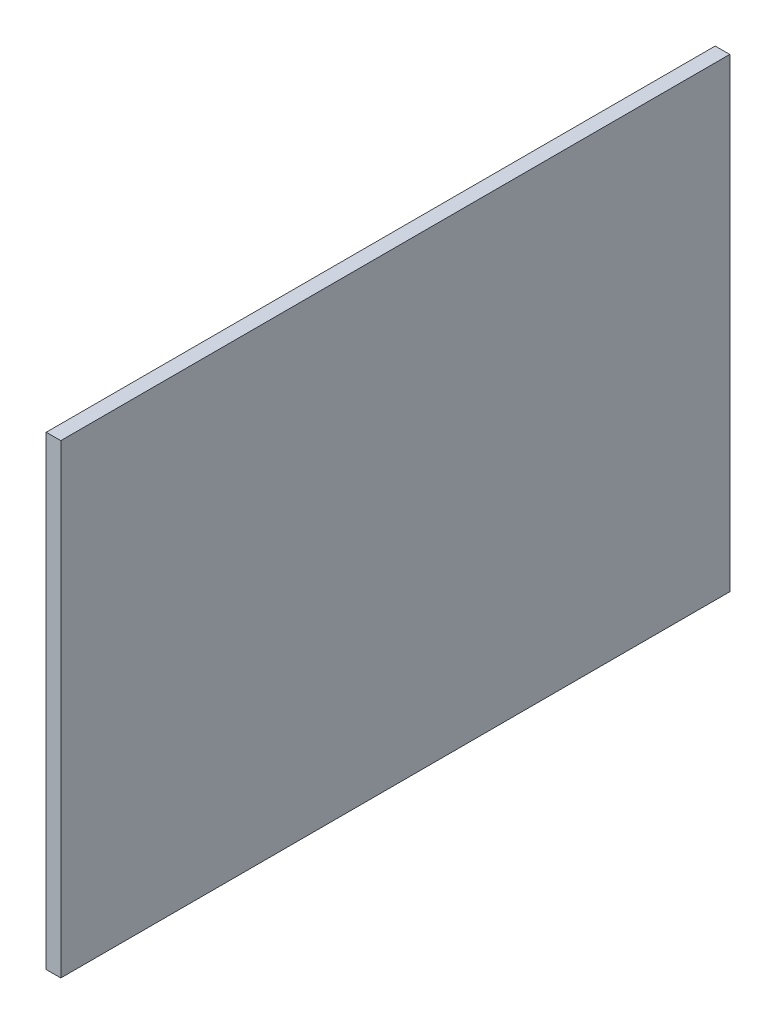
ISO-10303-21;
HEADER;
FILE_DESCRIPTION(('STEP AP214'),'2;1');
FILE_NAME('part.step','',(''),(''),'','','');
FILE_SCHEMA(('AUTOMOTIVE_DESIGN { 1 0 10303 214 1 1 1 1 }'));
ENDSEC;
DATA;
#1=APPLICATION_CONTEXT('core data for automotive mechanical design processes');
#2=APPLICATION_PROTOCOL_DEFINITION('international standard','automotive_design',2000,#1);
#3=PRODUCT_CONTEXT('',#1,'mechanical');
#4=PRODUCT('Part','Part','',(#3));
#5=PRODUCT_RELATED_PRODUCT_CATEGORY('part','',(#4));
#6=PRODUCT_DEFINITION_FORMATION('','',#4);
#7=PRODUCT_DEFINITION_CONTEXT('part definition',#1,'design');
#8=PRODUCT_DEFINITION('design','',#6,#7);
#9=PRODUCT_DEFINITION_SHAPE('','',#8);
#10=(LENGTH_UNIT() NAMED_UNIT(*) SI_UNIT(.MILLI.,.METRE.));
#11=(NAMED_UNIT(*) PLANE_ANGLE_UNIT() SI_UNIT($,.RADIAN.));
#12=(NAMED_UNIT(*) SI_UNIT($,.STERADIAN.) SOLID_ANGLE_UNIT());
#13=UNCERTAINTY_MEASURE_WITH_UNIT(LENGTH_MEASURE(1.E-05),#10,'distance_accuracy_value','');
#14=(GEOMETRIC_REPRESENTATION_CONTEXT(3) GLOBAL_UNCERTAINTY_ASSIGNED_CONTEXT((#13)) GLOBAL_UNIT_ASSIGNED_CONTEXT((#10,
#11,#12)) REPRESENTATION_CONTEXT('',''));
#15=CARTESIAN_POINT('',(0.,0.,0.));
#16=DIRECTION('',(0.,0.,1.));
#17=DIRECTION('',(1.,0.,0.));
#18=AXIS2_PLACEMENT_3D('',#15,#16,#17);
#19=CARTESIAN_POINT('',(3.175,57.9577808529253,74.9412550679312));
#20=DIRECTION('',(0.,0.,-1.));
#21=DIRECTION('',(-1.,0.,0.));
#22=AXIS2_PLACEMENT_3D('',#19,#20,#21);
#23=PLANE('',#22);
#24=DIRECTION('',(0.,-1.,0.));
#25=VECTOR('',#24,1.);
#26=CARTESIAN_POINT('',(0.,57.9577808529253,74.9412550679312));
#27=LINE('',#26,#25);
#28=CARTESIAN_POINT('',(0.,57.9577808529253,74.9412550679312));
#29=VERTEX_POINT('',#28);
#30=CARTESIAN_POINT('',(0.,-43.6422191470747,74.9412550679312));
#31=VERTEX_POINT('',#30);
#32=EDGE_CURVE('E96',#29,#31,#27,.T.);
#33=ORIENTED_EDGE('',*,*,#32,.T.);
#34=DIRECTION('',(-1.,0.,0.));
#35=VECTOR('',#34,1.);
#36=CARTESIAN_POINT('',(3.175,-43.6422191470747,74.9412550679312));
#37=LINE('',#36,#35);
#38=CARTESIAN_POINT('',(3.175,-43.6422191470747,74.9412550679312));
#39=VERTEX_POINT('',#38);
#40=EDGE_CURVE('E11',#39,#31,#37,.T.);
#41=ORIENTED_EDGE('',*,*,#40,.F.);
#42=DIRECTION('',(0.,-1.,0.));
#43=VECTOR('',#42,1.);
#44=CARTESIAN_POINT('',(3.175,57.9577808529253,74.9412550679312));
#45=LINE('',#44,#43);
#46=CARTESIAN_POINT('',(3.175,57.9577808529253,74.9412550679312));
#47=VERTEX_POINT('',#46);
#48=EDGE_CURVE('E84',#47,#39,#45,.T.);
#49=ORIENTED_EDGE('',*,*,#48,.F.);
#50=DIRECTION('',(-1.,0.,0.));
#51=VECTOR('',#50,1.);
#52=CARTESIAN_POINT('',(3.175,57.9577808529253,74.9412550679312));
#53=LINE('',#52,#51);
#54=EDGE_CURVE('E92',#47,#29,#53,.T.);
#55=ORIENTED_EDGE('',*,*,#54,.T.);
#56=EDGE_LOOP('',(#33,#41,#49,#55));
#57=FACE_BOUND('',#56,.T.);
#58=ADVANCED_FACE('F33',(#57),#23,.F.);
#59=CARTESIAN_POINT('',(3.175,-43.6422191470747,74.9412550679312));
#60=DIRECTION('',(0.,1.,0.));
#61=DIRECTION('',(0.,0.,1.));
#62=AXIS2_PLACEMENT_3D('',#59,#60,#61);
#63=PLANE('',#62);
#64=DIRECTION('',(0.,0.,-1.));
#65=VECTOR('',#64,1.);
#66=CARTESIAN_POINT('',(0.,-43.6422191470747,74.9412550679312));
#67=LINE('',#66,#65);
#68=CARTESIAN_POINT('',(0.,-43.6422191470747,-71.1087449320688));
#69=VERTEX_POINT('',#68);
#70=EDGE_CURVE('E88',#31,#69,#67,.T.);
#71=ORIENTED_EDGE('',*,*,#70,.T.);
#72=DIRECTION('',(-1.,0.,0.));
#73=VECTOR('',#72,1.);
#74=CARTESIAN_POINT('',(3.175,-43.6422191470747,-71.1087449320688));
#75=LINE('',#74,#73);
#76=CARTESIAN_POINT('',(3.175,-43.6422191470747,-71.1087449320688));
#77=VERTEX_POINT('',#76);
#78=EDGE_CURVE('E41',#77,#69,#75,.T.);
#79=ORIENTED_EDGE('',*,*,#78,.F.);
#80=DIRECTION('',(0.,0.,-1.));
#81=VECTOR('',#80,1.);
#82=CARTESIAN_POINT('',(3.175,-43.6422191470747,74.9412550679312));
#83=LINE('',#82,#81);
#84=EDGE_CURVE('E79',#39,#77,#83,.T.);
#85=ORIENTED_EDGE('',*,*,#84,.F.);
#86=ORIENTED_EDGE('',*,*,#40,.T.);
#87=EDGE_LOOP('',(#71,#79,#85,#86));
#88=FACE_BOUND('',#87,.T.);
#89=ADVANCED_FACE('F87',(#88),#63,.F.);
#90=CARTESIAN_POINT('',(3.175,57.9577808529253,-71.1087449320688));
#91=DIRECTION('',(0.,0.,1.));
#92=DIRECTION('',(0.,-1.,0.));
#93=AXIS2_PLACEMENT_3D('',#90,#91,#92);
#94=PLANE('',#93);
#95=DIRECTION('',(0.,1.,0.));
#96=VECTOR('',#95,1.);
#97=CARTESIAN_POINT('',(0.,57.9577808529253,-71.1087449320688));
#98=LINE('',#97,#96);
#99=CARTESIAN_POINT('',(0.,57.9577808529253,-71.1087449320688));
#100=VERTEX_POINT('',#99);
#101=EDGE_CURVE('E66',#69,#100,#98,.T.);
#102=ORIENTED_EDGE('',*,*,#101,.T.);
#103=DIRECTION('',(-1.,0.,0.));
#104=VECTOR('',#103,1.);
#105=CARTESIAN_POINT('',(3.175,57.9577808529253,-71.1087449320688));
#106=LINE('',#105,#104);
#107=CARTESIAN_POINT('',(3.175,57.9577808529253,-71.1087449320688));
#108=VERTEX_POINT('',#107);
#109=EDGE_CURVE('E89',#108,#100,#106,.T.);
#110=ORIENTED_EDGE('',*,*,#109,.F.);
#111=DIRECTION('',(0.,1.,0.));
#112=VECTOR('',#111,1.);
#113=CARTESIAN_POINT('',(3.175,57.9577808529253,-71.1087449320688));
#114=LINE('',#113,#112);
#115=EDGE_CURVE('E82',#77,#108,#114,.T.);
#116=ORIENTED_EDGE('',*,*,#115,.F.);
#117=ORIENTED_EDGE('',*,*,#78,.T.);
#118=EDGE_LOOP('',(#102,#110,#116,#117));
#119=FACE_BOUND('',#118,.T.);
#120=ADVANCED_FACE('F90',(#119),#94,.F.);
#121=CARTESIAN_POINT('',(3.175,57.9577808529253,74.9412550679312));
#122=DIRECTION('',(0.,-1.,0.));
#123=DIRECTION('',(0.,0.,-1.));
#124=AXIS2_PLACEMENT_3D('',#121,#122,#123);
#125=PLANE('',#124);
#126=DIRECTION('',(0.,0.,1.));
#127=VECTOR('',#126,1.);
#128=CARTESIAN_POINT('',(0.,57.9577808529253,74.9412550679312));
#129=LINE('',#128,#127);
#130=EDGE_CURVE('E72',#100,#29,#129,.T.);
#131=ORIENTED_EDGE('',*,*,#130,.T.);
#132=ORIENTED_EDGE('',*,*,#54,.F.);
#133=DIRECTION('',(0.,0.,1.));
#134=VECTOR('',#133,1.);
#135=CARTESIAN_POINT('',(3.175,57.9577808529253,74.9412550679312));
#136=LINE('',#135,#134);
#137=EDGE_CURVE('E49',#108,#47,#136,.T.);
#138=ORIENTED_EDGE('',*,*,#137,.F.);
#139=ORIENTED_EDGE('',*,*,#109,.T.);
#140=EDGE_LOOP('',(#131,#132,#138,#139));
#141=FACE_BOUND('',#140,.T.);
#142=ADVANCED_FACE('F103',(#141),#125,.F.);
#143=CARTESIAN_POINT('',(3.175,-43.6422191470747,74.9412550679312));
#144=DIRECTION('',(1.,0.,0.));
#145=DIRECTION('',(0.,0.,-1.));
#146=AXIS2_PLACEMENT_3D('',#143,#144,#145);
#147=PLANE('',#146);
#148=ORIENTED_EDGE('',*,*,#48,.T.);
#149=ORIENTED_EDGE('',*,*,#84,.T.);
#150=ORIENTED_EDGE('',*,*,#115,.T.);
#151=ORIENTED_EDGE('',*,*,#137,.T.);
#152=EDGE_LOOP('',(#148,#149,#150,#151));
#153=FACE_BOUND('',#152,.T.);
#154=ADVANCED_FACE('F80',(#153),#147,.T.);
#155=CARTESIAN_POINT('',(0.,-43.6422191470747,74.9412550679312));
#156=DIRECTION('',(1.,0.,0.));
#157=DIRECTION('',(0.,0.,-1.));
#158=AXIS2_PLACEMENT_3D('',#155,#156,#157);
#159=PLANE('',#158);
#160=ORIENTED_EDGE('',*,*,#32,.F.);
#161=ORIENTED_EDGE('',*,*,#130,.F.);
#162=ORIENTED_EDGE('',*,*,#101,.F.);
#163=ORIENTED_EDGE('',*,*,#70,.F.);
#164=EDGE_LOOP('',(#160,#161,#162,#163));
#165=FACE_BOUND('',#164,.T.);
#166=ADVANCED_FACE('F106',(#165),#159,.F.);
#167=CLOSED_SHELL('',(#58,#89,#120,#142,#154,#166));
#168=MANIFOLD_SOLID_BREP('B2',#167);
#169=ADVANCED_BREP_SHAPE_REPRESENTATION('',(#18,#168),#14);
#170=SHAPE_DEFINITION_REPRESENTATION(#9,#169);
ENDSEC;
END-ISO-10303-21;
